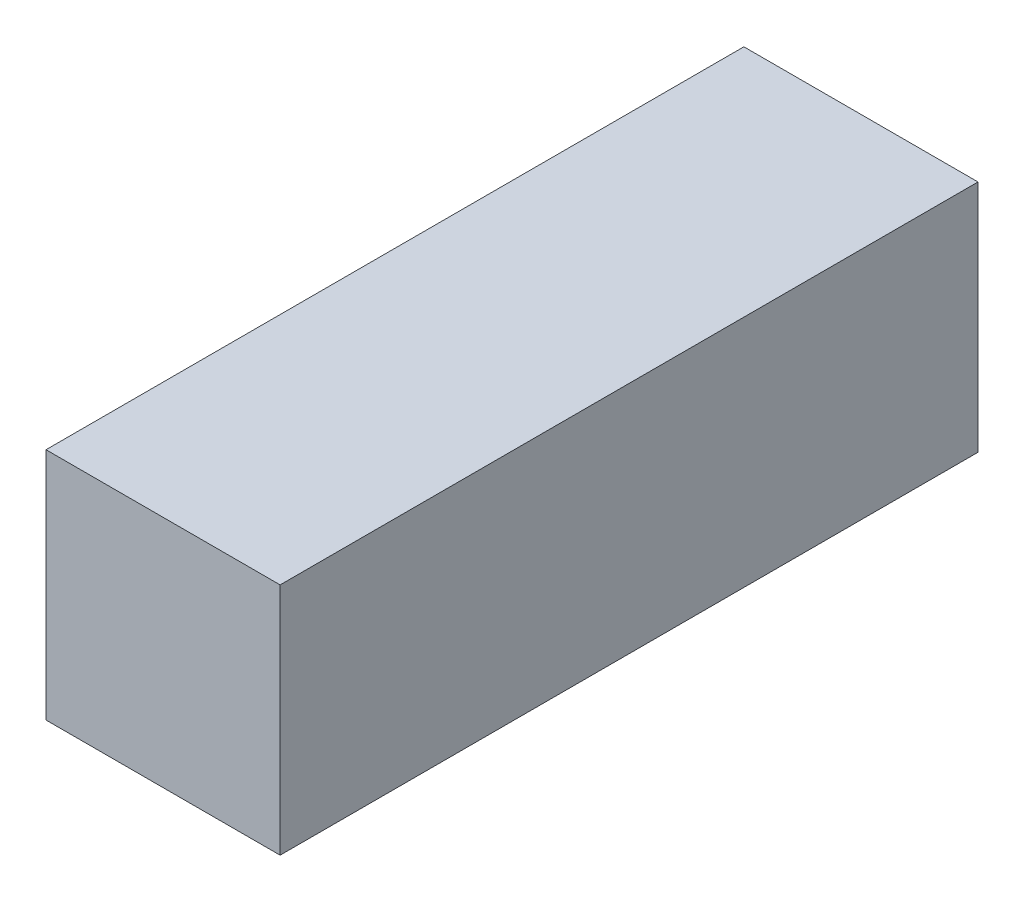
ISO-10303-21;
HEADER;
FILE_DESCRIPTION(('STEP AP214'),'2;1');
FILE_NAME('part.step','',(''),(''),'','','');
FILE_SCHEMA(('AUTOMOTIVE_DESIGN { 1 0 10303 214 1 1 1 1 }'));
ENDSEC;
DATA;
#1=APPLICATION_CONTEXT('core data for automotive mechanical design processes');
#2=APPLICATION_PROTOCOL_DEFINITION('international standard','automotive_design',2000,#1);
#3=PRODUCT_CONTEXT('',#1,'mechanical');
#4=PRODUCT('Part','Part','',(#3));
#5=PRODUCT_RELATED_PRODUCT_CATEGORY('part','',(#4));
#6=PRODUCT_DEFINITION_FORMATION('','',#4);
#7=PRODUCT_DEFINITION_CONTEXT('part definition',#1,'design');
#8=PRODUCT_DEFINITION('design','',#6,#7);
#9=PRODUCT_DEFINITION_SHAPE('','',#8);
#10=(LENGTH_UNIT() NAMED_UNIT(*) SI_UNIT(.MILLI.,.METRE.));
#11=(NAMED_UNIT(*) PLANE_ANGLE_UNIT() SI_UNIT($,.RADIAN.));
#12=(NAMED_UNIT(*) SI_UNIT($,.STERADIAN.) SOLID_ANGLE_UNIT());
#13=UNCERTAINTY_MEASURE_WITH_UNIT(LENGTH_MEASURE(1.E-05),#10,'distance_accuracy_value','');
#14=(GEOMETRIC_REPRESENTATION_CONTEXT(3) GLOBAL_UNCERTAINTY_ASSIGNED_CONTEXT((#13)) GLOBAL_UNIT_ASSIGNED_CONTEXT((#10,
#11,#12)) REPRESENTATION_CONTEXT('',''));
#15=CARTESIAN_POINT('',(0.,0.,0.));
#16=DIRECTION('',(0.,0.,1.));
#17=DIRECTION('',(1.,0.,0.));
#18=AXIS2_PLACEMENT_3D('',#15,#16,#17);
#19=CARTESIAN_POINT('',(0.,0.,0.));
#20=DIRECTION('',(0.,0.,-1.));
#21=DIRECTION('',(-1.,0.,0.));
#22=AXIS2_PLACEMENT_3D('',#19,#20,#21);
#23=PLANE('',#22);
#24=DIRECTION('',(-1.,0.,0.));
#25=VECTOR('',#24,1.);
#26=CARTESIAN_POINT('',(-1333.5,2628.9,0.));
#27=LINE('',#26,#25);
#28=CARTESIAN_POINT('',(1333.5,2628.9,0.));
#29=VERTEX_POINT('',#28);
#30=CARTESIAN_POINT('',(-1333.5,2628.9,0.));
#31=VERTEX_POINT('',#30);
#32=EDGE_CURVE('E181',#29,#31,#27,.T.);
#33=ORIENTED_EDGE('',*,*,#32,.F.);
#34=DIRECTION('',(0.,1.,0.));
#35=VECTOR('',#34,1.);
#36=CARTESIAN_POINT('',(1333.5,2628.9,0.));
#37=LINE('',#36,#35);
#38=CARTESIAN_POINT('',(1333.5,-38.0999999999996,0.));
#39=VERTEX_POINT('',#38);
#40=EDGE_CURVE('E66',#39,#29,#37,.T.);
#41=ORIENTED_EDGE('',*,*,#40,.F.);
#42=DIRECTION('',(1.,0.,0.));
#43=VECTOR('',#42,1.);
#44=CARTESIAN_POINT('',(-1333.5,-38.1000000000002,0.));
#45=LINE('',#44,#43);
#46=CARTESIAN_POINT('',(-1333.5,-38.1000000000002,0.));
#47=VERTEX_POINT('',#46);
#48=EDGE_CURVE('E186',#47,#39,#45,.T.);
#49=ORIENTED_EDGE('',*,*,#48,.F.);
#50=DIRECTION('',(0.,-1.,0.));
#51=VECTOR('',#50,1.);
#52=CARTESIAN_POINT('',(-1333.5,2628.9,0.));
#53=LINE('',#52,#51);
#54=EDGE_CURVE('E117',#31,#47,#53,.T.);
#55=ORIENTED_EDGE('',*,*,#54,.F.);
#56=EDGE_LOOP('',(#33,#41,#49,#55));
#57=FACE_BOUND('',#56,.T.);
#58=DIRECTION('',(1.,0.,0.));
#59=VECTOR('',#58,1.);
#60=CARTESIAN_POINT('',(-1295.4,-2.22044604925031E-13,0.));
#61=LINE('',#60,#59);
#62=CARTESIAN_POINT('',(-1295.4,-2.22044604925031E-13,0.));
#63=VERTEX_POINT('',#62);
#64=CARTESIAN_POINT('',(1295.4,2.53877634159613E-13,0.));
#65=VERTEX_POINT('',#64);
#66=EDGE_CURVE('E147',#63,#65,#61,.T.);
#67=ORIENTED_EDGE('',*,*,#66,.T.);
#68=DIRECTION('',(0.,1.,0.));
#69=VECTOR('',#68,1.);
#70=CARTESIAN_POINT('',(1295.4,2590.8,0.));
#71=LINE('',#70,#69);
#72=CARTESIAN_POINT('',(1295.4,2590.8,0.));
#73=VERTEX_POINT('',#72);
#74=EDGE_CURVE('E58',#65,#73,#71,.T.);
#75=ORIENTED_EDGE('',*,*,#74,.T.);
#76=DIRECTION('',(-1.,0.,0.));
#77=VECTOR('',#76,1.);
#78=CARTESIAN_POINT('',(-1295.4,2590.8,0.));
#79=LINE('',#78,#77);
#80=CARTESIAN_POINT('',(-1295.4,2590.8,0.));
#81=VERTEX_POINT('',#80);
#82=EDGE_CURVE('E160',#73,#81,#79,.T.);
#83=ORIENTED_EDGE('',*,*,#82,.T.);
#84=DIRECTION('',(0.,-1.,0.));
#85=VECTOR('',#84,1.);
#86=CARTESIAN_POINT('',(-1295.4,2590.8,0.));
#87=LINE('',#86,#85);
#88=EDGE_CURVE('E164',#81,#63,#87,.T.);
#89=ORIENTED_EDGE('',*,*,#88,.T.);
#90=EDGE_LOOP('',(#67,#75,#83,#89));
#91=FACE_BOUND('',#90,.T.);
#92=ADVANCED_FACE('F42',(#57,#91),#23,.T.);
#93=CARTESIAN_POINT('',(-1333.5,2628.9,7924.8));
#94=DIRECTION('',(0.,-1.,0.));
#95=DIRECTION('',(1.,0.,0.));
#96=AXIS2_PLACEMENT_3D('',#93,#94,#95);
#97=PLANE('',#96);
#98=ORIENTED_EDGE('',*,*,#32,.T.);
#99=DIRECTION('',(0.,0.,-1.));
#100=VECTOR('',#99,1.);
#101=CARTESIAN_POINT('',(-1333.5,2628.9,7924.8));
#102=LINE('',#101,#100);
#103=CARTESIAN_POINT('',(-1333.5,2628.9,7950.2));
#104=VERTEX_POINT('',#103);
#105=EDGE_CURVE('E11',#104,#31,#102,.T.);
#106=ORIENTED_EDGE('',*,*,#105,.F.);
#107=DIRECTION('',(-1.,0.,0.));
#108=VECTOR('',#107,1.);
#109=CARTESIAN_POINT('',(1333.5,2628.9,7950.2));
#110=LINE('',#109,#108);
#111=CARTESIAN_POINT('',(1333.5,2628.9,7950.2));
#112=VERTEX_POINT('',#111);
#113=EDGE_CURVE('E134',#112,#104,#110,.T.);
#114=ORIENTED_EDGE('',*,*,#113,.F.);
#115=DIRECTION('',(0.,0.,-1.));
#116=VECTOR('',#115,1.);
#117=CARTESIAN_POINT('',(1333.5,2628.9,7924.8));
#118=LINE('',#117,#116);
#119=EDGE_CURVE('E191',#112,#29,#118,.T.);
#120=ORIENTED_EDGE('',*,*,#119,.T.);
#121=EDGE_LOOP('',(#98,#106,#114,#120));
#122=FACE_BOUND('',#121,.T.);
#123=ADVANCED_FACE('F44',(#122),#97,.F.);
#124=CARTESIAN_POINT('',(-1333.5,2628.9,7924.8));
#125=DIRECTION('',(1.,0.,0.));
#126=DIRECTION('',(0.,0.,-1.));
#127=AXIS2_PLACEMENT_3D('',#124,#125,#126);
#128=PLANE('',#127);
#129=ORIENTED_EDGE('',*,*,#54,.T.);
#130=DIRECTION('',(0.,0.,-1.));
#131=VECTOR('',#130,1.);
#132=CARTESIAN_POINT('',(-1333.5,-38.1000000000002,7924.8));
#133=LINE('',#132,#131);
#134=CARTESIAN_POINT('',(-1333.5,-38.1000000000002,7950.2));
#135=VERTEX_POINT('',#134);
#136=EDGE_CURVE('E51',#135,#47,#133,.T.);
#137=ORIENTED_EDGE('',*,*,#136,.F.);
#138=DIRECTION('',(0.,-1.,0.));
#139=VECTOR('',#138,1.);
#140=CARTESIAN_POINT('',(-1333.5,2628.9,7950.2));
#141=LINE('',#140,#139);
#142=EDGE_CURVE('E116',#104,#135,#141,.T.);
#143=ORIENTED_EDGE('',*,*,#142,.F.);
#144=ORIENTED_EDGE('',*,*,#105,.T.);
#145=EDGE_LOOP('',(#129,#137,#143,#144));
#146=FACE_BOUND('',#145,.T.);
#147=ADVANCED_FACE('F114',(#146),#128,.F.);
#148=CARTESIAN_POINT('',(-1333.5,-38.1000000000002,7924.8));
#149=DIRECTION('',(0.,1.,0.));
#150=DIRECTION('',(-1.,0.,0.));
#151=AXIS2_PLACEMENT_3D('',#148,#149,#150);
#152=PLANE('',#151);
#153=ORIENTED_EDGE('',*,*,#48,.T.);
#154=DIRECTION('',(0.,0.,-1.));
#155=VECTOR('',#154,1.);
#156=CARTESIAN_POINT('',(1333.5,-38.0999999999996,7924.8));
#157=LINE('',#156,#155);
#158=CARTESIAN_POINT('',(1333.5,-38.0999999999996,7950.2));
#159=VERTEX_POINT('',#158);
#160=EDGE_CURVE('E121',#159,#39,#157,.T.);
#161=ORIENTED_EDGE('',*,*,#160,.F.);
#162=DIRECTION('',(1.,0.,0.));
#163=VECTOR('',#162,1.);
#164=CARTESIAN_POINT('',(-1333.5,-38.1000000000002,7950.2));
#165=LINE('',#164,#163);
#166=EDGE_CURVE('E123',#135,#159,#165,.T.);
#167=ORIENTED_EDGE('',*,*,#166,.F.);
#168=ORIENTED_EDGE('',*,*,#136,.T.);
#169=EDGE_LOOP('',(#153,#161,#167,#168));
#170=FACE_BOUND('',#169,.T.);
#171=ADVANCED_FACE('F124',(#170),#152,.F.);
#172=CARTESIAN_POINT('',(1333.5,2628.9,7924.8));
#173=DIRECTION('',(-1.,0.,0.));
#174=DIRECTION('',(0.,-1.,0.));
#175=AXIS2_PLACEMENT_3D('',#172,#173,#174);
#176=PLANE('',#175);
#177=ORIENTED_EDGE('',*,*,#40,.T.);
#178=ORIENTED_EDGE('',*,*,#119,.F.);
#179=DIRECTION('',(0.,1.,0.));
#180=VECTOR('',#179,1.);
#181=CARTESIAN_POINT('',(1333.5,-38.0999999999996,7950.2));
#182=LINE('',#181,#180);
#183=EDGE_CURVE('E129',#159,#112,#182,.T.);
#184=ORIENTED_EDGE('',*,*,#183,.F.);
#185=ORIENTED_EDGE('',*,*,#160,.T.);
#186=EDGE_LOOP('',(#177,#178,#184,#185));
#187=FACE_BOUND('',#186,.T.);
#188=ADVANCED_FACE('F194',(#187),#176,.F.);
#189=CARTESIAN_POINT('',(1295.4,2590.8,7924.8));
#190=DIRECTION('',(-1.,0.,0.));
#191=DIRECTION('',(0.,-1.,0.));
#192=AXIS2_PLACEMENT_3D('',#189,#190,#191);
#193=PLANE('',#192);
#194=ORIENTED_EDGE('',*,*,#74,.F.);
#195=DIRECTION('',(0.,0.,-1.));
#196=VECTOR('',#195,1.);
#197=CARTESIAN_POINT('',(1295.4,2.53877634159613E-13,7924.8));
#198=LINE('',#197,#196);
#199=CARTESIAN_POINT('',(1295.4,2.53877634159613E-13,7924.8));
#200=VERTEX_POINT('',#199);
#201=EDGE_CURVE('E157',#200,#65,#198,.T.);
#202=ORIENTED_EDGE('',*,*,#201,.F.);
#203=DIRECTION('',(0.,1.,0.));
#204=VECTOR('',#203,1.);
#205=CARTESIAN_POINT('',(1295.4,2590.8,7924.8));
#206=LINE('',#205,#204);
#207=CARTESIAN_POINT('',(1295.4,2590.8,7924.8));
#208=VERTEX_POINT('',#207);
#209=EDGE_CURVE('E142',#200,#208,#206,.T.);
#210=ORIENTED_EDGE('',*,*,#209,.T.);
#211=DIRECTION('',(0.,0.,-1.));
#212=VECTOR('',#211,1.);
#213=CARTESIAN_POINT('',(1295.4,2590.8,7924.8));
#214=LINE('',#213,#212);
#215=EDGE_CURVE('E179',#208,#73,#214,.T.);
#216=ORIENTED_EDGE('',*,*,#215,.T.);
#217=EDGE_LOOP('',(#194,#202,#210,#216));
#218=FACE_BOUND('',#217,.T.);
#219=ADVANCED_FACE('F210',(#218),#193,.T.);
#220=CARTESIAN_POINT('',(-1295.4,2590.8,7924.8));
#221=DIRECTION('',(0.,-1.,0.));
#222=DIRECTION('',(0.,0.,-1.));
#223=AXIS2_PLACEMENT_3D('',#220,#221,#222);
#224=PLANE('',#223);
#225=ORIENTED_EDGE('',*,*,#82,.F.);
#226=ORIENTED_EDGE('',*,*,#215,.F.);
#227=DIRECTION('',(-1.,0.,0.));
#228=VECTOR('',#227,1.);
#229=CARTESIAN_POINT('',(-1295.4,2590.8,7924.8));
#230=LINE('',#229,#228);
#231=CARTESIAN_POINT('',(-1295.4,2590.8,7924.8));
#232=VERTEX_POINT('',#231);
#233=EDGE_CURVE('E146',#208,#232,#230,.T.);
#234=ORIENTED_EDGE('',*,*,#233,.T.);
#235=DIRECTION('',(0.,0.,-1.));
#236=VECTOR('',#235,1.);
#237=CARTESIAN_POINT('',(-1295.4,2590.8,7924.8));
#238=LINE('',#237,#236);
#239=EDGE_CURVE('E176',#232,#81,#238,.T.);
#240=ORIENTED_EDGE('',*,*,#239,.T.);
#241=EDGE_LOOP('',(#225,#226,#234,#240));
#242=FACE_BOUND('',#241,.T.);
#243=ADVANCED_FACE('F231',(#242),#224,.T.);
#244=CARTESIAN_POINT('',(-1295.4,2590.8,7924.8));
#245=DIRECTION('',(1.,0.,0.));
#246=DIRECTION('',(0.,0.,-1.));
#247=AXIS2_PLACEMENT_3D('',#244,#245,#246);
#248=PLANE('',#247);
#249=ORIENTED_EDGE('',*,*,#88,.F.);
#250=ORIENTED_EDGE('',*,*,#239,.F.);
#251=DIRECTION('',(0.,-1.,0.));
#252=VECTOR('',#251,1.);
#253=CARTESIAN_POINT('',(-1295.4,2590.8,7924.8));
#254=LINE('',#253,#252);
#255=CARTESIAN_POINT('',(-1295.4,-2.22044604925031E-13,7924.8));
#256=VERTEX_POINT('',#255);
#257=EDGE_CURVE('E150',#232,#256,#254,.T.);
#258=ORIENTED_EDGE('',*,*,#257,.T.);
#259=DIRECTION('',(0.,0.,-1.));
#260=VECTOR('',#259,1.);
#261=CARTESIAN_POINT('',(-1295.4,-2.22044604925031E-13,7924.8));
#262=LINE('',#261,#260);
#263=EDGE_CURVE('E173',#256,#63,#262,.T.);
#264=ORIENTED_EDGE('',*,*,#263,.T.);
#265=EDGE_LOOP('',(#249,#250,#258,#264));
#266=FACE_BOUND('',#265,.T.);
#267=ADVANCED_FACE('F224',(#266),#248,.T.);
#268=CARTESIAN_POINT('',(-1295.4,-2.22044604925031E-13,7924.8));
#269=DIRECTION('',(0.,1.,0.));
#270=DIRECTION('',(-1.,0.,0.));
#271=AXIS2_PLACEMENT_3D('',#268,#269,#270);
#272=PLANE('',#271);
#273=ORIENTED_EDGE('',*,*,#66,.F.);
#274=ORIENTED_EDGE('',*,*,#263,.F.);
#275=DIRECTION('',(1.,0.,0.));
#276=VECTOR('',#275,1.);
#277=CARTESIAN_POINT('',(-1295.4,-2.22044604925031E-13,7924.8));
#278=LINE('',#277,#276);
#279=EDGE_CURVE('E153',#256,#200,#278,.T.);
#280=ORIENTED_EDGE('',*,*,#279,.T.);
#281=ORIENTED_EDGE('',*,*,#201,.T.);
#282=EDGE_LOOP('',(#273,#274,#280,#281));
#283=FACE_BOUND('',#282,.T.);
#284=ADVANCED_FACE('F221',(#283),#272,.T.);
#285=CARTESIAN_POINT('',(0.,0.,7924.8));
#286=DIRECTION('',(0.,0.,1.));
#287=DIRECTION('',(1.,0.,0.));
#288=AXIS2_PLACEMENT_3D('',#285,#286,#287);
#289=PLANE('',#288);
#290=ORIENTED_EDGE('',*,*,#209,.F.);
#291=ORIENTED_EDGE('',*,*,#279,.F.);
#292=ORIENTED_EDGE('',*,*,#257,.F.);
#293=ORIENTED_EDGE('',*,*,#233,.F.);
#294=EDGE_LOOP('',(#290,#291,#292,#293));
#295=FACE_BOUND('',#294,.T.);
#296=ADVANCED_FACE('F223',(#295),#289,.F.);
#297=CARTESIAN_POINT('',(0.,0.,7950.2));
#298=DIRECTION('',(0.,0.,1.));
#299=DIRECTION('',(1.,0.,0.));
#300=AXIS2_PLACEMENT_3D('',#297,#298,#299);
#301=PLANE('',#300);
#302=ORIENTED_EDGE('',*,*,#142,.T.);
#303=ORIENTED_EDGE('',*,*,#166,.T.);
#304=ORIENTED_EDGE('',*,*,#183,.T.);
#305=ORIENTED_EDGE('',*,*,#113,.T.);
#306=EDGE_LOOP('',(#302,#303,#304,#305));
#307=FACE_BOUND('',#306,.T.);
#308=ADVANCED_FACE('F132',(#307),#301,.T.);
#309=CLOSED_SHELL('',(#92,#123,#147,#171,#188,#219,#243,#267,#284,#296,#308));
#310=MANIFOLD_SOLID_BREP('B2',#309);
#311=ADVANCED_BREP_SHAPE_REPRESENTATION('',(#18,#310),#14);
#312=SHAPE_DEFINITION_REPRESENTATION(#9,#311);
ENDSEC;
END-ISO-10303-21;
